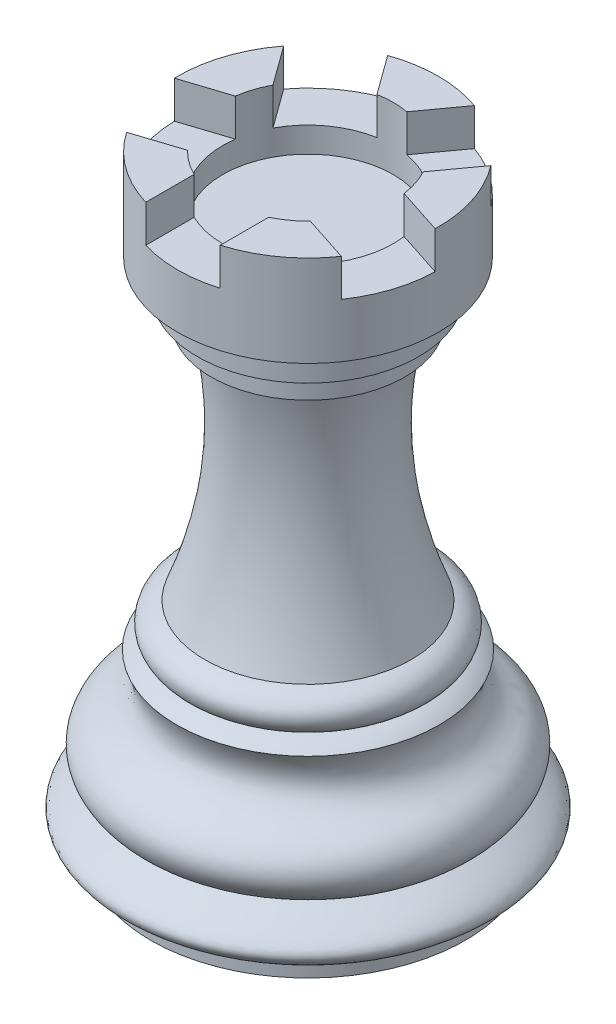
ISO-10303-21;
HEADER;
FILE_DESCRIPTION(('STEP AP214'),'2;1');
FILE_NAME('part.step','',(''),(''),'','','');
FILE_SCHEMA(('AUTOMOTIVE_DESIGN { 1 0 10303 214 1 1 1 1 }'));
ENDSEC;
DATA;
#1=APPLICATION_CONTEXT('core data for automotive mechanical design processes');
#2=APPLICATION_PROTOCOL_DEFINITION('international standard','automotive_design',2000,#1);
#3=PRODUCT_CONTEXT('',#1,'mechanical');
#4=PRODUCT('Part','Part','',(#3));
#5=PRODUCT_RELATED_PRODUCT_CATEGORY('part','',(#4));
#6=PRODUCT_DEFINITION_FORMATION('','',#4);
#7=PRODUCT_DEFINITION_CONTEXT('part definition',#1,'design');
#8=PRODUCT_DEFINITION('design','',#6,#7);
#9=PRODUCT_DEFINITION_SHAPE('','',#8);
#10=(LENGTH_UNIT() NAMED_UNIT(*) SI_UNIT(.MILLI.,.METRE.));
#11=(NAMED_UNIT(*) PLANE_ANGLE_UNIT() SI_UNIT($,.RADIAN.));
#12=(NAMED_UNIT(*) SI_UNIT($,.STERADIAN.) SOLID_ANGLE_UNIT());
#13=UNCERTAINTY_MEASURE_WITH_UNIT(LENGTH_MEASURE(1.E-05),#10,'distance_accuracy_value','');
#14=(GEOMETRIC_REPRESENTATION_CONTEXT(3) GLOBAL_UNCERTAINTY_ASSIGNED_CONTEXT((#13)) GLOBAL_UNIT_ASSIGNED_CONTEXT((#10,
#11,#12)) REPRESENTATION_CONTEXT('',''));
#15=CARTESIAN_POINT('',(0.,0.,0.));
#16=DIRECTION('',(0.,0.,1.));
#17=DIRECTION('',(1.,0.,0.));
#18=AXIS2_PLACEMENT_3D('',#15,#16,#17);
#19=CARTESIAN_POINT('',(0.,0.,0.));
#20=DIRECTION('',(0.,-1.,0.));
#21=DIRECTION('',(0.,0.,-1.));
#22=AXIS2_PLACEMENT_3D('',#19,#20,#21);
#23=CYLINDRICAL_SURFACE('',#22,57.5210916871156);
#24=CARTESIAN_POINT('',(0.,226.302750581283,0.));
#25=DIRECTION('',(0.,-1.,0.));
#26=DIRECTION('',(0.,0.,-1.));
#27=AXIS2_PLACEMENT_3D('',#24,#25,#26);
#28=CIRCLE('',#27,57.5210916871156);
#29=CARTESIAN_POINT('',(0.,226.302750581283,-57.5210916871156));
#30=VERTEX_POINT('',#29);
#31=EDGE_CURVE('E210',#30,#30,#28,.T.);
#32=ORIENTED_EDGE('',*,*,#31,.F.);
#33=EDGE_LOOP('',(#32));
#34=FACE_BOUND('',#33,.T.);
#35=DIRECTION('',(0.,-1.,0.));
#36=VECTOR('',#35,1.);
#37=CARTESIAN_POINT('',(57.5034863087967,0.,1.42304294088054));
#38=LINE('',#37,#36);
#39=CARTESIAN_POINT('',(57.5034863087967,266.575064592113,1.42304294088055));
#40=VERTEX_POINT('',#39);
#41=CARTESIAN_POINT('',(57.5034863087967,250.141255563931,1.42304294088055));
#42=VERTEX_POINT('',#41);
#43=EDGE_CURVE('E175',#40,#42,#38,.T.);
#44=ORIENTED_EDGE('',*,*,#43,.T.);
#45=CARTESIAN_POINT('',(0.,250.141255563931,0.));
#46=DIRECTION('',(0.,1.,0.));
#47=DIRECTION('',(0.,0.,1.));
#48=AXIS2_PLACEMENT_3D('',#45,#46,#47);
#49=CIRCLE('',#48,57.5210916871156);
#50=CARTESIAN_POINT('',(47.3577413136514,250.141255563931,32.6484352848163));
#51=VERTEX_POINT('',#50);
#52=EDGE_CURVE('E239',#42,#51,#49,.F.);
#53=ORIENTED_EDGE('',*,*,#52,.T.);
#54=DIRECTION('',(0.,-1.,0.));
#55=VECTOR('',#54,1.);
#56=CARTESIAN_POINT('',(47.3577413136514,0.,32.6484352848163));
#57=LINE('',#56,#55);
#58=CARTESIAN_POINT('',(47.3577413136514,266.575064592113,32.6484352848163));
#59=VERTEX_POINT('',#58);
#60=EDGE_CURVE('E189',#51,#59,#57,.F.);
#61=ORIENTED_EDGE('',*,*,#60,.T.);
#62=CARTESIAN_POINT('',(0.,266.575064592113,0.));
#63=DIRECTION('',(0.,-1.,0.));
#64=DIRECTION('',(0.,0.,-1.));
#65=AXIS2_PLACEMENT_3D('',#62,#63,#64);
#66=CIRCLE('',#65,57.5210916871156);
#67=CARTESIAN_POINT('',(16.4161602433337,266.575064592113,55.1288098161275));
#68=VERTEX_POINT('',#67);
#69=EDGE_CURVE('E205',#59,#68,#66,.T.);
#70=ORIENTED_EDGE('',*,*,#69,.T.);
#71=DIRECTION('',(0.,-1.,0.));
#72=VECTOR('',#71,1.);
#73=CARTESIAN_POINT('',(16.4161602433337,0.,55.1288098161275));
#74=LINE('',#73,#72);
#75=CARTESIAN_POINT('',(16.4161602433337,250.141255563931,55.1288098161275));
#76=VERTEX_POINT('',#75);
#77=EDGE_CURVE('E341',#68,#76,#74,.T.);
#78=ORIENTED_EDGE('',*,*,#77,.T.);
#79=CARTESIAN_POINT('',(0.,250.141255563931,0.));
#80=DIRECTION('',(0.,1.,0.));
#81=DIRECTION('',(0.,0.,1.));
#82=AXIS2_PLACEMENT_3D('',#79,#80,#81);
#83=CIRCLE('',#82,57.5210916871156);
#84=CARTESIAN_POINT('',(-16.4161602433337,250.141255563931,55.1288098161275));
#85=VERTEX_POINT('',#84);
#86=EDGE_CURVE('E358',#76,#85,#83,.F.);
#87=ORIENTED_EDGE('',*,*,#86,.T.);
#88=DIRECTION('',(0.,-1.,0.));
#89=VECTOR('',#88,1.);
#90=CARTESIAN_POINT('',(-16.4161602433337,0.,55.1288098161275));
#91=LINE('',#90,#89);
#92=CARTESIAN_POINT('',(-16.4161602433337,266.575064592113,55.1288098161275));
#93=VERTEX_POINT('',#92);
#94=EDGE_CURVE('E338',#85,#93,#91,.F.);
#95=ORIENTED_EDGE('',*,*,#94,.T.);
#96=CARTESIAN_POINT('',(-47.3577413136519,266.575064592113,32.6484352848156));
#97=VERTEX_POINT('',#96);
#98=EDGE_CURVE('E207',#93,#97,#66,.T.);
#99=ORIENTED_EDGE('',*,*,#98,.T.);
#100=DIRECTION('',(0.,-1.,0.));
#101=VECTOR('',#100,1.);
#102=CARTESIAN_POINT('',(-47.3577413136519,0.,32.6484352848156));
#103=LINE('',#102,#101);
#104=CARTESIAN_POINT('',(-47.3577413136519,250.141255563931,32.6484352848156));
#105=VERTEX_POINT('',#104);
#106=EDGE_CURVE('E313',#97,#105,#103,.T.);
#107=ORIENTED_EDGE('',*,*,#106,.T.);
#108=CARTESIAN_POINT('',(0.,250.141255563931,0.));
#109=DIRECTION('',(0.,1.,0.));
#110=DIRECTION('',(0.,0.,1.));
#111=AXIS2_PLACEMENT_3D('',#108,#109,#110);
#112=CIRCLE('',#111,57.5210916871156);
#113=CARTESIAN_POINT('',(-57.5034863087967,250.141255563931,1.42304294087972));
#114=VERTEX_POINT('',#113);
#115=EDGE_CURVE('E329',#105,#114,#112,.F.);
#116=ORIENTED_EDGE('',*,*,#115,.T.);
#117=DIRECTION('',(0.,-1.,0.));
#118=VECTOR('',#117,1.);
#119=CARTESIAN_POINT('',(-57.5034863087967,0.,1.42304294087972));
#120=LINE('',#119,#118);
#121=CARTESIAN_POINT('',(-57.5034863087967,266.575064592113,1.42304294087972));
#122=VERTEX_POINT('',#121);
#123=EDGE_CURVE('E310',#114,#122,#120,.F.);
#124=ORIENTED_EDGE('',*,*,#123,.T.);
#125=CARTESIAN_POINT('',(-45.6848540055954,266.575064592113,-34.9509671306102));
#126=VERTEX_POINT('',#125);
#127=EDGE_CURVE('E211',#122,#126,#66,.T.);
#128=ORIENTED_EDGE('',*,*,#127,.T.);
#129=DIRECTION('',(0.,-1.,0.));
#130=VECTOR('',#129,1.);
#131=CARTESIAN_POINT('',(-45.6848540055954,0.,-34.9509671306103));
#132=LINE('',#131,#130);
#133=CARTESIAN_POINT('',(-45.6848540055954,250.141255563931,-34.9509671306103));
#134=VERTEX_POINT('',#133);
#135=EDGE_CURVE('E285',#126,#134,#132,.T.);
#136=ORIENTED_EDGE('',*,*,#135,.T.);
#137=CARTESIAN_POINT('',(0.,250.141255563931,0.));
#138=DIRECTION('',(0.,1.,0.));
#139=DIRECTION('',(0.,0.,1.));
#140=AXIS2_PLACEMENT_3D('',#137,#138,#139);
#141=CIRCLE('',#140,57.5210916871156);
#142=CARTESIAN_POINT('',(-19.1229487671167,250.141255563931,-54.2493209112132));
#143=VERTEX_POINT('',#142);
#144=EDGE_CURVE('E301',#134,#143,#141,.F.);
#145=ORIENTED_EDGE('',*,*,#144,.T.);
#146=DIRECTION('',(0.,-1.,0.));
#147=VECTOR('',#146,1.);
#148=CARTESIAN_POINT('',(-19.1229487671167,0.,-54.2493209112132));
#149=LINE('',#148,#147);
#150=CARTESIAN_POINT('',(-19.1229487671166,266.575064592113,-54.2493209112132));
#151=VERTEX_POINT('',#150);
#152=EDGE_CURVE('E282',#143,#151,#149,.F.);
#153=ORIENTED_EDGE('',*,*,#152,.T.);
#154=CARTESIAN_POINT('',(19.1229487671174,266.575064592113,-54.2493209112129));
#155=VERTEX_POINT('',#154);
#156=EDGE_CURVE('E813',#151,#155,#66,.T.);
#157=ORIENTED_EDGE('',*,*,#156,.T.);
#158=DIRECTION('',(0.,-1.,0.));
#159=VECTOR('',#158,1.);
#160=CARTESIAN_POINT('',(19.1229487671174,0.,-54.2493209112129));
#161=LINE('',#160,#159);
#162=CARTESIAN_POINT('',(19.1229487671174,250.141255563931,-54.2493209112129));
#163=VERTEX_POINT('',#162);
#164=EDGE_CURVE('E260',#155,#163,#161,.T.);
#165=ORIENTED_EDGE('',*,*,#164,.T.);
#166=CARTESIAN_POINT('',(0.,250.141255563931,0.));
#167=DIRECTION('',(0.,1.,0.));
#168=DIRECTION('',(0.,0.,1.));
#169=AXIS2_PLACEMENT_3D('',#166,#167,#168);
#170=CIRCLE('',#169,57.5210916871156);
#171=CARTESIAN_POINT('',(45.6848540055959,250.141255563931,-34.9509671306096));
#172=VERTEX_POINT('',#171);
#173=EDGE_CURVE('E273',#163,#172,#170,.F.);
#174=ORIENTED_EDGE('',*,*,#173,.T.);
#175=DIRECTION('',(0.,-1.,0.));
#176=VECTOR('',#175,1.);
#177=CARTESIAN_POINT('',(45.6848540055959,0.,-34.9509671306096));
#178=LINE('',#177,#176);
#179=CARTESIAN_POINT('',(45.6848540055959,266.575064592113,-34.9509671306096));
#180=VERTEX_POINT('',#179);
#181=EDGE_CURVE('E258',#172,#180,#178,.F.);
#182=ORIENTED_EDGE('',*,*,#181,.T.);
#183=EDGE_CURVE('E241',#180,#40,#66,.T.);
#184=ORIENTED_EDGE('',*,*,#183,.T.);
#185=EDGE_LOOP('',(#44,#53,#61,#70,#78,#87,#95,#99,#107,#116,#124,#128,#136,#145,#153,#157,#165,
#174,#182,#184));
#186=FACE_BOUND('',#185,.T.);
#187=ADVANCED_FACE('F32',(#34,#186),#23,.T.);
#188=CARTESIAN_POINT('',(-37.5725293623646,266.575064592113,0.));
#189=DIRECTION('',(0.,-1.,0.));
#190=DIRECTION('',(0.,0.,-1.));
#191=AXIS2_PLACEMENT_3D('',#188,#189,#190);
#192=PLANE('',#191);
#193=DIRECTION('',(-0.95105651629515,0.,-0.309016994374958));
#194=VECTOR('',#193,1.);
#195=CARTESIAN_POINT('',(108.802676986613,266.575064592113,18.0911603929113));
#196=LINE('',#195,#194);
#197=CARTESIAN_POINT('',(37.215271403501,266.575064592113,-5.1689976832563));
#198=VERTEX_POINT('',#197);
#199=EDGE_CURVE('E169',#40,#198,#196,.T.);
#200=ORIENTED_EDGE('',*,*,#199,.F.);
#201=ORIENTED_EDGE('',*,*,#183,.F.);
#202=DIRECTION('',(-0.58778525229248,0.,0.809016994374942));
#203=VECTOR('',#202,1.);
#204=CARTESIAN_POINT('',(84.3458219921264,266.575064592113,-88.1632244951841));
#205=LINE('',#204,#203);
#206=CARTESIAN_POINT('',(33.1460476230607,266.575064592113,-17.6927807214));
#207=VERTEX_POINT('',#206);
#208=EDGE_CURVE('E194',#180,#207,#205,.T.);
#209=ORIENTED_EDGE('',*,*,#208,.T.);
#210=CARTESIAN_POINT('',(0.,266.575064592113,0.));
#211=DIRECTION('',(0.,-1.,0.));
#212=DIRECTION('',(0.,0.,-1.));
#213=AXIS2_PLACEMENT_3D('',#210,#211,#212);
#214=CIRCLE('',#213,37.5725293623646);
#215=EDGE_CURVE('E187',#207,#198,#214,.T.);
#216=ORIENTED_EDGE('',*,*,#215,.T.);
#217=EDGE_LOOP('',(#200,#201,#209,#216));
#218=FACE_BOUND('',#217,.T.);
#219=ADVANCED_FACE('F193',(#218),#192,.F.);
#220=DIRECTION('',(-0.95105651629515,0.,-0.309016994374958));
#221=VECTOR('',#220,1.);
#222=CARTESIAN_POINT('',(98.6569319914681,266.575064592113,49.316552736847));
#223=LINE('',#222,#221);
#224=CARTESIAN_POINT('',(27.0695264083557,266.575064592113,26.0563946606794));
#225=VERTEX_POINT('',#224);
#226=EDGE_CURVE('E181',#59,#225,#223,.T.);
#227=ORIENTED_EDGE('',*,*,#226,.T.);
#228=CARTESIAN_POINT('',(16.4161602433337,266.575064592113,33.7965182459812));
#229=VERTEX_POINT('',#228);
#230=EDGE_CURVE('E196',#225,#229,#214,.T.);
#231=ORIENTED_EDGE('',*,*,#230,.T.);
#232=DIRECTION('',(0.,0.,-1.));
#233=VECTOR('',#232,1.);
#234=CARTESIAN_POINT('',(16.4161602433337,266.575064592113,86.5568318231254));
#235=LINE('',#234,#233);
#236=EDGE_CURVE('E352',#68,#229,#235,.T.);
#237=ORIENTED_EDGE('',*,*,#236,.F.);
#238=ORIENTED_EDGE('',*,*,#69,.F.);
#239=EDGE_LOOP('',(#227,#231,#237,#238));
#240=FACE_BOUND('',#239,.T.);
#241=ADVANCED_FACE('F440',(#240),#192,.F.);
#242=CARTESIAN_POINT('',(0.,0.,0.));
#243=DIRECTION('',(0.,-1.,0.));
#244=DIRECTION('',(0.,0.,-1.));
#245=AXIS2_PLACEMENT_3D('',#242,#243,#244);
#246=CYLINDRICAL_SURFACE('',#245,37.5725293623646);
#247=CARTESIAN_POINT('',(0.,239.031603244535,0.));
#248=DIRECTION('',(0.,-1.,0.));
#249=DIRECTION('',(0.,0.,-1.));
#250=AXIS2_PLACEMENT_3D('',#247,#248,#249);
#251=CIRCLE('',#250,37.5725293623646);
#252=CARTESIAN_POINT('',(0.,239.031603244535,-37.5725293623646));
#253=VERTEX_POINT('',#252);
#254=EDGE_CURVE('E200',#253,#253,#251,.T.);
#255=ORIENTED_EDGE('',*,*,#254,.T.);
#256=EDGE_LOOP('',(#255));
#257=FACE_BOUND('',#256,.T.);
#258=DIRECTION('',(0.,-1.,0.));
#259=VECTOR('',#258,1.);
#260=CARTESIAN_POINT('',(37.215271403501,0.,-5.16899768325631));
#261=LINE('',#260,#259);
#262=CARTESIAN_POINT('',(37.215271403501,250.141255563931,-5.1689976832563));
#263=VERTEX_POINT('',#262);
#264=EDGE_CURVE('E172',#263,#198,#261,.F.);
#265=ORIENTED_EDGE('',*,*,#264,.T.);
#266=ORIENTED_EDGE('',*,*,#215,.F.);
#267=DIRECTION('',(0.,-1.,0.));
#268=VECTOR('',#267,1.);
#269=CARTESIAN_POINT('',(33.1460476230607,0.,-17.6927807214));
#270=LINE('',#269,#268);
#271=CARTESIAN_POINT('',(33.1460476230607,250.141255563931,-17.6927807214));
#272=VERTEX_POINT('',#271);
#273=EDGE_CURVE('E253',#207,#272,#270,.T.);
#274=ORIENTED_EDGE('',*,*,#273,.T.);
#275=CARTESIAN_POINT('',(0.,250.141255563931,0.));
#276=DIRECTION('',(0.,1.,0.));
#277=DIRECTION('',(0.,0.,1.));
#278=AXIS2_PLACEMENT_3D('',#275,#276,#277);
#279=CIRCLE('',#278,37.5725293623646);
#280=CARTESIAN_POINT('',(6.58414238458225,250.141255563931,-36.9911345020033));
#281=VERTEX_POINT('',#280);
#282=EDGE_CURVE('E270',#272,#281,#279,.T.);
#283=ORIENTED_EDGE('',*,*,#282,.T.);
#284=DIRECTION('',(0.,-1.,0.));
#285=VECTOR('',#284,1.);
#286=CARTESIAN_POINT('',(6.58414238458225,0.,-36.9911345020033));
#287=LINE('',#286,#285);
#288=CARTESIAN_POINT('',(6.58414238458225,266.575064592113,-36.9911345020033));
#289=VERTEX_POINT('',#288);
#290=EDGE_CURVE('E255',#281,#289,#287,.F.);
#291=ORIENTED_EDGE('',*,*,#290,.T.);
#292=CARTESIAN_POINT('',(-6.58414238458172,266.575064592113,-36.9911345020034));
#293=VERTEX_POINT('',#292);
#294=EDGE_CURVE('E195',#293,#289,#214,.T.);
#295=ORIENTED_EDGE('',*,*,#294,.F.);
#296=DIRECTION('',(0.,-1.,0.));
#297=VECTOR('',#296,1.);
#298=CARTESIAN_POINT('',(-6.58414238458172,0.,-36.9911345020034));
#299=LINE('',#298,#297);
#300=CARTESIAN_POINT('',(-6.58414238458172,250.141255563931,-36.9911345020034));
#301=VERTEX_POINT('',#300);
#302=EDGE_CURVE('E276',#293,#301,#299,.T.);
#303=ORIENTED_EDGE('',*,*,#302,.T.);
#304=CARTESIAN_POINT('',(0.,250.141255563931,0.));
#305=DIRECTION('',(0.,1.,0.));
#306=DIRECTION('',(0.,0.,1.));
#307=AXIS2_PLACEMENT_3D('',#304,#305,#306);
#308=CIRCLE('',#307,37.5725293623646);
#309=CARTESIAN_POINT('',(-33.1460476230605,250.141255563931,-17.6927807214004));
#310=VERTEX_POINT('',#309);
#311=EDGE_CURVE('E298',#301,#310,#308,.T.);
#312=ORIENTED_EDGE('',*,*,#311,.T.);
#313=DIRECTION('',(0.,-1.,0.));
#314=VECTOR('',#313,1.);
#315=CARTESIAN_POINT('',(-33.1460476230605,0.,-17.6927807214004));
#316=LINE('',#315,#314);
#317=CARTESIAN_POINT('',(-33.1460476230605,266.575064592113,-17.6927807214004));
#318=VERTEX_POINT('',#317);
#319=EDGE_CURVE('E279',#310,#318,#316,.F.);
#320=ORIENTED_EDGE('',*,*,#319,.T.);
#321=CARTESIAN_POINT('',(-37.2152714035009,266.575064592113,-5.16899768325685));
#322=VERTEX_POINT('',#321);
#323=EDGE_CURVE('E199',#322,#318,#214,.T.);
#324=ORIENTED_EDGE('',*,*,#323,.F.);
#325=DIRECTION('',(0.,-1.,0.));
#326=VECTOR('',#325,1.);
#327=CARTESIAN_POINT('',(-37.2152714035009,0.,-5.16899768325685));
#328=LINE('',#327,#326);
#329=CARTESIAN_POINT('',(-37.2152714035009,250.141255563931,-5.16899768325685));
#330=VERTEX_POINT('',#329);
#331=EDGE_CURVE('E304',#322,#330,#328,.T.);
#332=ORIENTED_EDGE('',*,*,#331,.T.);
#333=CARTESIAN_POINT('',(0.,250.141255563931,0.));
#334=DIRECTION('',(0.,1.,0.));
#335=DIRECTION('',(0.,0.,1.));
#336=AXIS2_PLACEMENT_3D('',#333,#334,#335);
#337=CIRCLE('',#336,37.5725293623646);
#338=CARTESIAN_POINT('',(-27.0695264083561,250.141255563931,26.056394660679));
#339=VERTEX_POINT('',#338);
#340=EDGE_CURVE('E326',#330,#339,#337,.T.);
#341=ORIENTED_EDGE('',*,*,#340,.T.);
#342=DIRECTION('',(0.,-1.,0.));
#343=VECTOR('',#342,1.);
#344=CARTESIAN_POINT('',(-27.0695264083561,0.,26.056394660679));
#345=LINE('',#344,#343);
#346=CARTESIAN_POINT('',(-27.0695264083561,266.575064592113,26.056394660679));
#347=VERTEX_POINT('',#346);
#348=EDGE_CURVE('E307',#339,#347,#345,.F.);
#349=ORIENTED_EDGE('',*,*,#348,.T.);
#350=CARTESIAN_POINT('',(-16.4161602433337,266.575064592113,33.7965182459812));
#351=VERTEX_POINT('',#350);
#352=EDGE_CURVE('E201',#351,#347,#214,.T.);
#353=ORIENTED_EDGE('',*,*,#352,.F.);
#354=DIRECTION('',(0.,-1.,0.));
#355=VECTOR('',#354,1.);
#356=CARTESIAN_POINT('',(-16.4161602433337,0.,33.7965182459812));
#357=LINE('',#356,#355);
#358=CARTESIAN_POINT('',(-16.4161602433337,250.141255563931,33.7965182459812));
#359=VERTEX_POINT('',#358);
#360=EDGE_CURVE('E332',#351,#359,#357,.T.);
#361=ORIENTED_EDGE('',*,*,#360,.T.);
#362=CARTESIAN_POINT('',(0.,250.141255563931,0.));
#363=DIRECTION('',(0.,1.,0.));
#364=DIRECTION('',(0.,0.,1.));
#365=AXIS2_PLACEMENT_3D('',#362,#363,#364);
#366=CIRCLE('',#365,37.5725293623646);
#367=CARTESIAN_POINT('',(16.4161602433337,250.141255563931,33.7965182459812));
#368=VERTEX_POINT('',#367);
#369=EDGE_CURVE('E355',#359,#368,#366,.T.);
#370=ORIENTED_EDGE('',*,*,#369,.T.);
#371=DIRECTION('',(0.,-1.,0.));
#372=VECTOR('',#371,1.);
#373=CARTESIAN_POINT('',(16.4161602433337,0.,33.7965182459812));
#374=LINE('',#373,#372);
#375=EDGE_CURVE('E335',#368,#229,#374,.F.);
#376=ORIENTED_EDGE('',*,*,#375,.T.);
#377=ORIENTED_EDGE('',*,*,#230,.F.);
#378=DIRECTION('',(0.,-1.,0.));
#379=VECTOR('',#378,1.);
#380=CARTESIAN_POINT('',(27.0695264083557,0.,26.0563946606794));
#381=LINE('',#380,#379);
#382=CARTESIAN_POINT('',(27.0695264083557,250.141255563931,26.0563946606794));
#383=VERTEX_POINT('',#382);
#384=EDGE_CURVE('E190',#225,#383,#381,.T.);
#385=ORIENTED_EDGE('',*,*,#384,.T.);
#386=CARTESIAN_POINT('',(0.,250.141255563931,0.));
#387=DIRECTION('',(0.,1.,0.));
#388=DIRECTION('',(0.,0.,1.));
#389=AXIS2_PLACEMENT_3D('',#386,#387,#388);
#390=CIRCLE('',#389,37.5725293623646);
#391=EDGE_CURVE('E180',#383,#263,#390,.T.);
#392=ORIENTED_EDGE('',*,*,#391,.T.);
#393=EDGE_LOOP('',(#265,#266,#274,#283,#291,#295,#303,#312,#320,#324,#332,#341,#349,#353,#361,
#370,#376,#377,#385,#392));
#394=FACE_BOUND('',#393,.T.);
#395=ADVANCED_FACE('F185',(#257,#394),#246,.F.);
#396=DIRECTION('',(-0.58778525229248,0.,0.809016994374942));
#397=VECTOR('',#396,1.);
#398=CARTESIAN_POINT('',(57.783916753648,266.575064592113,-107.461578275787));
#399=LINE('',#398,#397);
#400=EDGE_CURVE('E268',#155,#289,#399,.T.);
#401=ORIENTED_EDGE('',*,*,#400,.F.);
#402=ORIENTED_EDGE('',*,*,#156,.F.);
#403=DIRECTION('',(0.587785252292469,0.,0.809016994374951));
#404=VECTOR('',#403,1.);
#405=CARTESIAN_POINT('',(-57.7839167536463,266.575064592113,-107.461578275788));
#406=LINE('',#405,#404);
#407=EDGE_CURVE('E293',#151,#293,#406,.T.);
#408=ORIENTED_EDGE('',*,*,#407,.T.);
#409=ORIENTED_EDGE('',*,*,#294,.T.);
#410=EDGE_LOOP('',(#401,#402,#408,#409));
#411=FACE_BOUND('',#410,.T.);
#412=ADVANCED_FACE('F439',(#411),#192,.F.);
#413=DIRECTION('',(0.587785252292469,0.,0.809016994374951));
#414=VECTOR('',#413,1.);
#415=CARTESIAN_POINT('',(-84.345821992125,266.575064592113,-88.1632244951851));
#416=LINE('',#415,#414);
#417=EDGE_CURVE('E296',#126,#318,#416,.T.);
#418=ORIENTED_EDGE('',*,*,#417,.F.);
#419=ORIENTED_EDGE('',*,*,#127,.F.);
#420=DIRECTION('',(0.951056516295154,0.,-0.309016994374945));
#421=VECTOR('',#420,1.);
#422=CARTESIAN_POINT('',(-108.802676986613,266.575064592113,18.0911603929095));
#423=LINE('',#422,#421);
#424=EDGE_CURVE('E321',#122,#322,#423,.T.);
#425=ORIENTED_EDGE('',*,*,#424,.T.);
#426=ORIENTED_EDGE('',*,*,#323,.T.);
#427=EDGE_LOOP('',(#418,#419,#425,#426));
#428=FACE_BOUND('',#427,.T.);
#429=ADVANCED_FACE('F444',(#428),#192,.F.);
#430=DIRECTION('',(0.951056516295154,0.,-0.309016994374945));
#431=VECTOR('',#430,1.);
#432=CARTESIAN_POINT('',(-98.656931991468,266.575064592113,49.3165527368454));
#433=LINE('',#432,#431);
#434=EDGE_CURVE('E324',#97,#347,#433,.T.);
#435=ORIENTED_EDGE('',*,*,#434,.F.);
#436=ORIENTED_EDGE('',*,*,#98,.F.);
#437=DIRECTION('',(0.,0.,-1.));
#438=VECTOR('',#437,1.);
#439=CARTESIAN_POINT('',(-16.4161602433337,266.575064592113,86.5568318231254));
#440=LINE('',#439,#438);
#441=EDGE_CURVE('E349',#93,#351,#440,.T.);
#442=ORIENTED_EDGE('',*,*,#441,.T.);
#443=ORIENTED_EDGE('',*,*,#352,.T.);
#444=EDGE_LOOP('',(#435,#436,#442,#443));
#445=FACE_BOUND('',#444,.T.);
#446=ADVANCED_FACE('F442',(#445),#192,.F.);
#447=CARTESIAN_POINT('',(-48.7584516199391,212.596057110734,0.));
#448=CARTESIAN_POINT('',(-42.4683762330746,211.963877378023,0.));
#449=CARTESIAN_POINT('',(-42.6140717883137,208.184707488028,0.));
#450=B_SPLINE_CURVE_WITH_KNOTS('',2,(#447,#448,#449),.UNSPECIFIED.,.F.,.F.,(3,3),(0.,1.),.UNSPECIFIED.);
#451=CARTESIAN_POINT('',(0.,0.,0.));
#452=DIRECTION('',(0.,-1.,0.));
#453=AXIS1_PLACEMENT('',#451,#452);
#454=SURFACE_OF_REVOLUTION('',#450,#453);
#455=CARTESIAN_POINT('',(0.,208.184707488028,0.));
#456=DIRECTION('',(0.,-1.,0.));
#457=DIRECTION('',(0.,0.,-1.));
#458=AXIS2_PLACEMENT_3D('',#455,#456,#457);
#459=CIRCLE('',#458,42.6140717883137);
#460=CARTESIAN_POINT('',(0.,208.184707488028,-42.6140717883137));
#461=VERTEX_POINT('',#460);
#462=EDGE_CURVE('E360',#461,#461,#459,.T.);
#463=ORIENTED_EDGE('',*,*,#462,.F.);
#464=EDGE_LOOP('',(#463));
#465=FACE_BOUND('',#464,.T.);
#466=CARTESIAN_POINT('',(0.,212.596057110734,0.));
#467=DIRECTION('',(0.,-1.,0.));
#468=DIRECTION('',(0.,0.,-1.));
#469=AXIS2_PLACEMENT_3D('',#466,#467,#468);
#470=CIRCLE('',#469,48.7584516199391);
#471=CARTESIAN_POINT('',(0.,212.596057110734,-48.7584516199391));
#472=VERTEX_POINT('',#471);
#473=EDGE_CURVE('E11',#472,#472,#470,.T.);
#474=ORIENTED_EDGE('',*,*,#473,.T.);
#475=EDGE_LOOP('',(#474));
#476=FACE_BOUND('',#475,.T.);
#477=ADVANCED_FACE('F34',(#465,#476),#454,.T.);
#478=CARTESIAN_POINT('',(0.,0.,0.));
#479=DIRECTION('',(0.,-1.,0.));
#480=DIRECTION('',(0.,0.,-1.));
#481=AXIS2_PLACEMENT_3D('',#478,#479,#480);
#482=CYLINDRICAL_SURFACE('',#481,48.7584516199391);
#483=ORIENTED_EDGE('',*,*,#473,.F.);
#484=EDGE_LOOP('',(#483));
#485=FACE_BOUND('',#484,.T.);
#486=CARTESIAN_POINT('',(0.,220.315918950468,0.));
#487=DIRECTION('',(0.,-1.,0.));
#488=DIRECTION('',(0.,0.,-1.));
#489=AXIS2_PLACEMENT_3D('',#486,#487,#488);
#490=CIRCLE('',#489,48.7584516199391);
#491=CARTESIAN_POINT('',(0.,220.315918950468,-48.7584516199391));
#492=VERTEX_POINT('',#491);
#493=EDGE_CURVE('E41',#492,#492,#490,.T.);
#494=ORIENTED_EDGE('',*,*,#493,.T.);
#495=EDGE_LOOP('',(#494));
#496=FACE_BOUND('',#495,.T.);
#497=ADVANCED_FACE('F219',(#485,#496),#482,.T.);
#498=CARTESIAN_POINT('',(-52.38206023859,226.302750581283,0.));
#499=CARTESIAN_POINT('',(-50.8426230589593,226.040332782466,0.));
#500=CARTESIAN_POINT('',(-49.0644437378156,225.689385990495,0.));
#501=CARTESIAN_POINT('',(-48.7584516199391,220.315918950468,0.));
#502=B_SPLINE_CURVE_WITH_KNOTS('',3,(#498,#499,#500,#501),.UNSPECIFIED.,.F.,.F.,(4,4),(0.,1.),.UNSPECIFIED.);
#503=CARTESIAN_POINT('',(0.,0.,0.));
#504=DIRECTION('',(0.,-1.,0.));
#505=AXIS1_PLACEMENT('',#503,#504);
#506=SURFACE_OF_REVOLUTION('',#502,#505);
#507=ORIENTED_EDGE('',*,*,#493,.F.);
#508=EDGE_LOOP('',(#507));
#509=FACE_BOUND('',#508,.T.);
#510=CARTESIAN_POINT('',(0.,226.302750581283,0.));
#511=DIRECTION('',(0.,-1.,0.));
#512=DIRECTION('',(0.,0.,-1.));
#513=AXIS2_PLACEMENT_3D('',#510,#511,#512);
#514=CIRCLE('',#513,52.38206023859);
#515=CARTESIAN_POINT('',(0.,226.302750581283,-52.38206023859));
#516=VERTEX_POINT('',#515);
#517=EDGE_CURVE('E214',#516,#516,#514,.T.);
#518=ORIENTED_EDGE('',*,*,#517,.T.);
#519=EDGE_LOOP('',(#518));
#520=FACE_BOUND('',#519,.T.);
#521=ADVANCED_FACE('F221',(#509,#520),#506,.T.);
#522=CARTESIAN_POINT('',(-57.5210916871156,226.302750581283,0.));
#523=DIRECTION('',(0.,1.,0.));
#524=DIRECTION('',(0.,0.,1.));
#525=AXIS2_PLACEMENT_3D('',#522,#523,#524);
#526=PLANE('',#525);
#527=ORIENTED_EDGE('',*,*,#517,.F.);
#528=EDGE_LOOP('',(#527));
#529=FACE_BOUND('',#528,.T.);
#530=ORIENTED_EDGE('',*,*,#31,.T.);
#531=EDGE_LOOP('',(#530));
#532=FACE_BOUND('',#531,.T.);
#533=ADVANCED_FACE('F224',(#529,#532),#526,.F.);
#534=CARTESIAN_POINT('',(-37.5725293623646,239.031603244535,0.));
#535=DIRECTION('',(0.,-1.,0.));
#536=DIRECTION('',(0.,0.,-1.));
#537=AXIS2_PLACEMENT_3D('',#534,#535,#536);
#538=PLANE('',#537);
#539=ORIENTED_EDGE('',*,*,#254,.F.);
#540=EDGE_LOOP('',(#539));
#541=FACE_BOUND('',#540,.T.);
#542=ADVANCED_FACE('F230',(#541),#538,.F.);
#543=CARTESIAN_POINT('',(0.,0.,0.));
#544=DIRECTION('',(0.,1.,0.));
#545=DIRECTION('',(0.,0.,1.));
#546=AXIS2_PLACEMENT_3D('',#543,#544,#545);
#547=PLANE('',#546);
#548=CARTESIAN_POINT('',(0.,0.,0.));
#549=DIRECTION('',(0.,-1.,0.));
#550=DIRECTION('',(0.,0.,-1.));
#551=AXIS2_PLACEMENT_3D('',#548,#549,#550);
#552=CIRCLE('',#551,69.3752884506841);
#553=CARTESIAN_POINT('',(0.,0.,-69.3752884506841));
#554=VERTEX_POINT('',#553);
#555=EDGE_CURVE('E486',#554,#554,#552,.T.);
#556=ORIENTED_EDGE('',*,*,#555,.T.);
#557=EDGE_LOOP('',(#556));
#558=FACE_BOUND('',#557,.T.);
#559=ADVANCED_FACE('F429',(#558),#547,.F.);
#560=CARTESIAN_POINT('',(0.,0.,0.));
#561=DIRECTION('',(0.,-1.,0.));
#562=DIRECTION('',(0.,0.,-1.));
#563=AXIS2_PLACEMENT_3D('',#560,#561,#562);
#564=CYLINDRICAL_SURFACE('',#563,69.3752884506841);
#565=ORIENTED_EDGE('',*,*,#555,.F.);
#566=EDGE_LOOP('',(#565));
#567=FACE_BOUND('',#566,.T.);
#568=CARTESIAN_POINT('',(0.,5.39170655839967,0.));
#569=DIRECTION('',(0.,-1.,0.));
#570=DIRECTION('',(0.,0.,-1.));
#571=AXIS2_PLACEMENT_3D('',#568,#569,#570);
#572=CIRCLE('',#571,69.3752884506841);
#573=CARTESIAN_POINT('',(0.,5.39170655839967,-69.3752884506841));
#574=VERTEX_POINT('',#573);
#575=EDGE_CURVE('E484',#574,#574,#572,.T.);
#576=ORIENTED_EDGE('',*,*,#575,.T.);
#577=EDGE_LOOP('',(#576));
#578=FACE_BOUND('',#577,.T.);
#579=ADVANCED_FACE('F425',(#567,#578),#564,.T.);
#580=CARTESIAN_POINT('',(-65.444879120116,27.8902875785498,0.));
#581=CARTESIAN_POINT('',(-88.6409738782525,17.1893641912147,0.));
#582=CARTESIAN_POINT('',(-84.4716897679982,14.7400823049093,0.));
#583=CARTESIAN_POINT('',(-69.375288450684,5.39170655839966,0.));
#584=B_SPLINE_CURVE_WITH_KNOTS('',3,(#580,#581,#582,#583),.UNSPECIFIED.,.F.,.F.,(4,4),(0.,1.),.UNSPECIFIED.);
#585=CARTESIAN_POINT('',(0.,0.,0.));
#586=DIRECTION('',(0.,-1.,0.));
#587=AXIS1_PLACEMENT('',#585,#586);
#588=SURFACE_OF_REVOLUTION('',#584,#587);
#589=ORIENTED_EDGE('',*,*,#575,.F.);
#590=EDGE_LOOP('',(#589));
#591=FACE_BOUND('',#590,.T.);
#592=CARTESIAN_POINT('',(0.,27.8902875785498,0.));
#593=DIRECTION('',(0.,-1.,0.));
#594=DIRECTION('',(0.,0.,-1.));
#595=AXIS2_PLACEMENT_3D('',#592,#593,#594);
#596=CIRCLE('',#595,65.444879120116);
#597=CARTESIAN_POINT('',(0.,27.8902875785498,-65.444879120116));
#598=VERTEX_POINT('',#597);
#599=EDGE_CURVE('E481',#598,#598,#596,.T.);
#600=ORIENTED_EDGE('',*,*,#599,.T.);
#601=EDGE_LOOP('',(#600));
#602=FACE_BOUND('',#601,.T.);
#603=ADVANCED_FACE('F422',(#591,#602),#588,.T.);
#604=CARTESIAN_POINT('',(-57.8992673098276,76.5422715045134,0.));
#605=CARTESIAN_POINT('',(-53.8611399801696,68.793250239356,0.));
#606=CARTESIAN_POINT('',(-52.3230202538275,59.4210076909661,0.));
#607=CARTESIAN_POINT('',(-72.6522646989101,50.0113888138938,0.));
#608=CARTESIAN_POINT('',(-78.9772436985183,38.4894045494582,0.));
#609=CARTESIAN_POINT('',(-69.3480096732948,28.8875773544093,0.));
#610=CARTESIAN_POINT('',(-65.444879120116,27.8902875785498,0.));
#611=B_SPLINE_CURVE_WITH_KNOTS('',3,(#604,#605,#606,#607,#608,#609,#610),.UNSPECIFIED.,.F.,.F.,
(4,1,1,1,4),(0.,0.533072534992515,0.606266249522038,0.825963286421147,1.),.UNSPECIFIED.);
#612=CARTESIAN_POINT('',(0.,0.,0.));
#613=DIRECTION('',(0.,-1.,0.));
#614=AXIS1_PLACEMENT('',#612,#613);
#615=SURFACE_OF_REVOLUTION('',#611,#614);
#616=ORIENTED_EDGE('',*,*,#599,.F.);
#617=EDGE_LOOP('',(#616));
#618=FACE_BOUND('',#617,.T.);
#619=CARTESIAN_POINT('',(0.,76.5422715045134,0.));
#620=DIRECTION('',(0.,-1.,0.));
#621=DIRECTION('',(0.,0.,-1.));
#622=AXIS2_PLACEMENT_3D('',#619,#620,#621);
#623=CIRCLE('',#622,57.8992673098276);
#624=CARTESIAN_POINT('',(0.,76.5422715045134,-57.8992673098276));
#625=VERTEX_POINT('',#624);
#626=EDGE_CURVE('E478',#625,#625,#623,.T.);
#627=ORIENTED_EDGE('',*,*,#626,.T.);
#628=EDGE_LOOP('',(#627));
#629=FACE_BOUND('',#628,.T.);
#630=ADVANCED_FACE('F394',(#618,#629),#615,.T.);
#631=CARTESIAN_POINT('',(-50.344750632212,80.3842617299665,0.));
#632=CARTESIAN_POINT('',(-54.4121160866412,79.1949589756904,0.));
#633=CARTESIAN_POINT('',(-57.8992673098276,76.5422715045134,0.));
#634=B_SPLINE_CURVE_WITH_KNOTS('',2,(#631,#632,#633),.UNSPECIFIED.,.F.,.F.,(3,3),(0.,1.),.UNSPECIFIED.);
#635=CARTESIAN_POINT('',(0.,0.,0.));
#636=DIRECTION('',(0.,-1.,0.));
#637=AXIS1_PLACEMENT('',#635,#636);
#638=SURFACE_OF_REVOLUTION('',#634,#637);
#639=ORIENTED_EDGE('',*,*,#626,.F.);
#640=EDGE_LOOP('',(#639));
#641=FACE_BOUND('',#640,.T.);
#642=CARTESIAN_POINT('',(0.,80.3842617299665,0.));
#643=DIRECTION('',(0.,-1.,0.));
#644=DIRECTION('',(0.,0.,-1.));
#645=AXIS2_PLACEMENT_3D('',#642,#643,#644);
#646=CIRCLE('',#645,50.344750632212);
#647=CARTESIAN_POINT('',(0.,80.3842617299665,-50.344750632212));
#648=VERTEX_POINT('',#647);
#649=EDGE_CURVE('E475',#648,#648,#646,.T.);
#650=ORIENTED_EDGE('',*,*,#649,.T.);
#651=EDGE_LOOP('',(#650));
#652=FACE_BOUND('',#651,.T.);
#653=ADVANCED_FACE('F390',(#641,#652),#638,.T.);
#654=CARTESIAN_POINT('',(-45.5412069517653,95.2929136299957,0.));
#655=CARTESIAN_POINT('',(-56.3302759510156,92.2682509235754,0.));
#656=CARTESIAN_POINT('',(-55.7015071052406,83.8254746828488,0.));
#657=CARTESIAN_POINT('',(-50.344750632212,80.3842617299665,0.));
#658=B_SPLINE_CURVE_WITH_KNOTS('',3,(#654,#655,#656,#657),.UNSPECIFIED.,.F.,.F.,(4,4),(0.,1.),.UNSPECIFIED.);
#659=CARTESIAN_POINT('',(0.,0.,0.));
#660=DIRECTION('',(0.,-1.,0.));
#661=AXIS1_PLACEMENT('',#659,#660);
#662=SURFACE_OF_REVOLUTION('',#658,#661);
#663=ORIENTED_EDGE('',*,*,#649,.F.);
#664=EDGE_LOOP('',(#663));
#665=FACE_BOUND('',#664,.T.);
#666=CARTESIAN_POINT('',(0.,95.2929136299957,0.));
#667=DIRECTION('',(0.,-1.,0.));
#668=DIRECTION('',(0.,0.,-1.));
#669=AXIS2_PLACEMENT_3D('',#666,#667,#668);
#670=CIRCLE('',#669,45.5412069517653);
#671=CARTESIAN_POINT('',(0.,95.2929136299957,-45.5412069517653));
#672=VERTEX_POINT('',#671);
#673=EDGE_CURVE('E472',#672,#672,#670,.T.);
#674=ORIENTED_EDGE('',*,*,#673,.T.);
#675=EDGE_LOOP('',(#674));
#676=FACE_BOUND('',#675,.T.);
#677=ADVANCED_FACE('F385',(#665,#676),#662,.T.);
#678=CARTESIAN_POINT('',(-35.9752495907701,198.889363640185,0.));
#679=CARTESIAN_POINT('',(-25.1751407995587,148.004290693057,0.));
#680=CARTESIAN_POINT('',(-45.5412069517653,95.2929136299957,0.));
#681=B_SPLINE_CURVE_WITH_KNOTS('',2,(#678,#679,#680),.UNSPECIFIED.,.F.,.F.,(3,3),(0.,1.),.UNSPECIFIED.);
#682=CARTESIAN_POINT('',(0.,0.,0.));
#683=DIRECTION('',(0.,-1.,0.));
#684=AXIS1_PLACEMENT('',#682,#683);
#685=SURFACE_OF_REVOLUTION('',#681,#684);
#686=ORIENTED_EDGE('',*,*,#673,.F.);
#687=EDGE_LOOP('',(#686));
#688=FACE_BOUND('',#687,.T.);
#689=CARTESIAN_POINT('',(0.,198.889363640185,0.));
#690=DIRECTION('',(0.,-1.,0.));
#691=DIRECTION('',(0.,0.,-1.));
#692=AXIS2_PLACEMENT_3D('',#689,#690,#691);
#693=CIRCLE('',#692,35.9752495907701);
#694=CARTESIAN_POINT('',(0.,198.889363640185,-35.9752495907701));
#695=VERTEX_POINT('',#694);
#696=EDGE_CURVE('E469',#695,#695,#693,.T.);
#697=ORIENTED_EDGE('',*,*,#696,.T.);
#698=EDGE_LOOP('',(#697));
#699=FACE_BOUND('',#698,.T.);
#700=ADVANCED_FACE('F380',(#688,#699),#685,.T.);
#701=CARTESIAN_POINT('',(-37.5725293623646,198.889363640185,0.));
#702=DIRECTION('',(0.,1.,0.));
#703=DIRECTION('',(0.,0.,1.));
#704=AXIS2_PLACEMENT_3D('',#701,#702,#703);
#705=PLANE('',#704);
#706=ORIENTED_EDGE('',*,*,#696,.F.);
#707=EDGE_LOOP('',(#706));
#708=FACE_BOUND('',#707,.T.);
#709=CARTESIAN_POINT('',(0.,198.889363640185,0.));
#710=DIRECTION('',(0.,-1.,0.));
#711=DIRECTION('',(0.,0.,-1.));
#712=AXIS2_PLACEMENT_3D('',#709,#710,#711);
#713=CIRCLE('',#712,37.5725293623646);
#714=CARTESIAN_POINT('',(0.,198.889363640185,-37.5725293623646));
#715=VERTEX_POINT('',#714);
#716=EDGE_CURVE('E466',#715,#715,#713,.T.);
#717=ORIENTED_EDGE('',*,*,#716,.T.);
#718=EDGE_LOOP('',(#717));
#719=FACE_BOUND('',#718,.T.);
#720=ADVANCED_FACE('F384',(#708,#719),#705,.F.);
#721=CARTESIAN_POINT('',(0.,0.,0.));
#722=DIRECTION('',(0.,-1.,0.));
#723=DIRECTION('',(0.,0.,-1.));
#724=AXIS2_PLACEMENT_3D('',#721,#722,#723);
#725=CYLINDRICAL_SURFACE('',#724,37.5725293623646);
#726=ORIENTED_EDGE('',*,*,#716,.F.);
#727=EDGE_LOOP('',(#726));
#728=FACE_BOUND('',#727,.T.);
#729=CARTESIAN_POINT('',(0.,201.725231254781,0.));
#730=DIRECTION('',(0.,-1.,0.));
#731=DIRECTION('',(0.,0.,-1.));
#732=AXIS2_PLACEMENT_3D('',#729,#730,#731);
#733=CIRCLE('',#732,37.5725293623646);
#734=CARTESIAN_POINT('',(0.,201.725231254781,-37.5725293623646));
#735=VERTEX_POINT('',#734);
#736=EDGE_CURVE('E461',#735,#735,#733,.T.);
#737=ORIENTED_EDGE('',*,*,#736,.T.);
#738=EDGE_LOOP('',(#737));
#739=FACE_BOUND('',#738,.T.);
#740=ADVANCED_FACE('F508',(#728,#739),#725,.T.);
#741=CARTESIAN_POINT('',(-37.5725293623646,201.725231254781,0.));
#742=DIRECTION('',(0.,1.,0.));
#743=DIRECTION('',(0.,0.,1.));
#744=AXIS2_PLACEMENT_3D('',#741,#742,#743);
#745=PLANE('',#744);
#746=ORIENTED_EDGE('',*,*,#736,.F.);
#747=EDGE_LOOP('',(#746));
#748=FACE_BOUND('',#747,.T.);
#749=CARTESIAN_POINT('',(0.,201.725231254781,0.));
#750=DIRECTION('',(0.,-1.,0.));
#751=DIRECTION('',(0.,0.,-1.));
#752=AXIS2_PLACEMENT_3D('',#749,#750,#751);
#753=CIRCLE('',#752,42.6140717883137);
#754=CARTESIAN_POINT('',(0.,201.725231254781,-42.6140717883137));
#755=VERTEX_POINT('',#754);
#756=EDGE_CURVE('E459',#755,#755,#753,.T.);
#757=ORIENTED_EDGE('',*,*,#756,.T.);
#758=EDGE_LOOP('',(#757));
#759=FACE_BOUND('',#758,.T.);
#760=ADVANCED_FACE('F513',(#748,#759),#745,.F.);
#761=CARTESIAN_POINT('',(0.,0.,0.));
#762=DIRECTION('',(0.,-1.,0.));
#763=DIRECTION('',(0.,0.,-1.));
#764=AXIS2_PLACEMENT_3D('',#761,#762,#763);
#765=CYLINDRICAL_SURFACE('',#764,42.6140717883137);
#766=ORIENTED_EDGE('',*,*,#756,.F.);
#767=EDGE_LOOP('',(#766));
#768=FACE_BOUND('',#767,.T.);
#769=ORIENTED_EDGE('',*,*,#462,.T.);
#770=EDGE_LOOP('',(#769));
#771=FACE_BOUND('',#770,.T.);
#772=ADVANCED_FACE('F518',(#768,#771),#765,.T.);
#773=CARTESIAN_POINT('',(16.4161602433337,250.141255563931,86.5568318231254));
#774=DIRECTION('',(-1.,0.,0.));
#775=DIRECTION('',(0.,0.,1.));
#776=AXIS2_PLACEMENT_3D('',#773,#774,#775);
#777=PLANE('',#776);
#778=ORIENTED_EDGE('',*,*,#236,.T.);
#779=ORIENTED_EDGE('',*,*,#375,.F.);
#780=DIRECTION('',(0.,0.,-1.));
#781=VECTOR('',#780,1.);
#782=CARTESIAN_POINT('',(16.4161602433337,250.141255563931,86.5568318231254));
#783=LINE('',#782,#781);
#784=EDGE_CURVE('E344',#76,#368,#783,.T.);
#785=ORIENTED_EDGE('',*,*,#784,.F.);
#786=ORIENTED_EDGE('',*,*,#77,.F.);
#787=EDGE_LOOP('',(#778,#779,#785,#786));
#788=FACE_BOUND('',#787,.T.);
#789=ADVANCED_FACE('F523',(#788),#777,.T.);
#790=CARTESIAN_POINT('',(-16.4161602433337,250.141255563931,86.5568318231254));
#791=DIRECTION('',(1.,0.,0.));
#792=DIRECTION('',(0.,0.,-1.));
#793=AXIS2_PLACEMENT_3D('',#790,#791,#792);
#794=PLANE('',#793);
#795=DIRECTION('',(0.,0.,-1.));
#796=VECTOR('',#795,1.);
#797=CARTESIAN_POINT('',(-16.4161602433337,250.141255563931,86.5568318231254));
#798=LINE('',#797,#796);
#799=EDGE_CURVE('E346',#85,#359,#798,.T.);
#800=ORIENTED_EDGE('',*,*,#799,.T.);
#801=ORIENTED_EDGE('',*,*,#360,.F.);
#802=ORIENTED_EDGE('',*,*,#441,.F.);
#803=ORIENTED_EDGE('',*,*,#94,.F.);
#804=EDGE_LOOP('',(#800,#801,#802,#803));
#805=FACE_BOUND('',#804,.T.);
#806=ADVANCED_FACE('F528',(#805),#794,.T.);
#807=CARTESIAN_POINT('',(16.4161602433337,250.141255563931,86.5568318231254));
#808=DIRECTION('',(0.,1.,0.));
#809=DIRECTION('',(0.,0.,1.));
#810=AXIS2_PLACEMENT_3D('',#807,#808,#809);
#811=PLANE('',#810);
#812=ORIENTED_EDGE('',*,*,#784,.T.);
#813=ORIENTED_EDGE('',*,*,#369,.F.);
#814=ORIENTED_EDGE('',*,*,#799,.F.);
#815=ORIENTED_EDGE('',*,*,#86,.F.);
#816=EDGE_LOOP('',(#812,#813,#814,#815));
#817=FACE_BOUND('',#816,.T.);
#818=ADVANCED_FACE('F534',(#817),#811,.T.);
#819=CARTESIAN_POINT('',(-98.656931991468,250.141255563931,49.3165527368454));
#820=DIRECTION('',(-0.309016994374945,0.,-0.951056516295154));
#821=DIRECTION('',(-0.951056516295155,0.,0.309016994374945));
#822=AXIS2_PLACEMENT_3D('',#819,#820,#821);
#823=PLANE('',#822);
#824=ORIENTED_EDGE('',*,*,#434,.T.);
#825=ORIENTED_EDGE('',*,*,#348,.F.);
#826=DIRECTION('',(0.951056516295154,0.,-0.309016994374945));
#827=VECTOR('',#826,1.);
#828=CARTESIAN_POINT('',(-98.656931991468,250.141255563931,49.3165527368454));
#829=LINE('',#828,#827);
#830=EDGE_CURVE('E316',#105,#339,#829,.T.);
#831=ORIENTED_EDGE('',*,*,#830,.F.);
#832=ORIENTED_EDGE('',*,*,#106,.F.);
#833=EDGE_LOOP('',(#824,#825,#831,#832));
#834=FACE_BOUND('',#833,.T.);
#835=ADVANCED_FACE('F538',(#834),#823,.T.);
#836=CARTESIAN_POINT('',(-108.802676986613,250.141255563931,18.0911603929095));
#837=DIRECTION('',(0.309016994374945,0.,0.951056516295154));
#838=DIRECTION('',(0.951056516295155,0.,-0.309016994374945));
#839=AXIS2_PLACEMENT_3D('',#836,#837,#838);
#840=PLANE('',#839);
#841=DIRECTION('',(0.951056516295154,0.,-0.309016994374945));
#842=VECTOR('',#841,1.);
#843=CARTESIAN_POINT('',(-108.802676986613,250.141255563931,18.0911603929095));
#844=LINE('',#843,#842);
#845=EDGE_CURVE('E318',#114,#330,#844,.T.);
#846=ORIENTED_EDGE('',*,*,#845,.T.);
#847=ORIENTED_EDGE('',*,*,#331,.F.);
#848=ORIENTED_EDGE('',*,*,#424,.F.);
#849=ORIENTED_EDGE('',*,*,#123,.F.);
#850=EDGE_LOOP('',(#846,#847,#848,#849));
#851=FACE_BOUND('',#850,.T.);
#852=ADVANCED_FACE('F542',(#851),#840,.T.);
#853=CARTESIAN_POINT('',(-98.656931991468,250.141255563931,49.3165527368454));
#854=DIRECTION('',(0.,1.,0.));
#855=DIRECTION('',(0.,0.,1.));
#856=AXIS2_PLACEMENT_3D('',#853,#854,#855);
#857=PLANE('',#856);
#858=ORIENTED_EDGE('',*,*,#830,.T.);
#859=ORIENTED_EDGE('',*,*,#340,.F.);
#860=ORIENTED_EDGE('',*,*,#845,.F.);
#861=ORIENTED_EDGE('',*,*,#115,.F.);
#862=EDGE_LOOP('',(#858,#859,#860,#861));
#863=FACE_BOUND('',#862,.T.);
#864=ADVANCED_FACE('F546',(#863),#857,.T.);
#865=CARTESIAN_POINT('',(-84.345821992125,250.141255563931,-88.1632244951851));
#866=DIRECTION('',(0.809016994374951,0.,-0.587785252292469));
#867=DIRECTION('',(-0.587785252292469,0.,-0.809016994374951));
#868=AXIS2_PLACEMENT_3D('',#865,#866,#867);
#869=PLANE('',#868);
#870=ORIENTED_EDGE('',*,*,#417,.T.);
#871=ORIENTED_EDGE('',*,*,#319,.F.);
#872=DIRECTION('',(0.587785252292469,0.,0.809016994374951));
#873=VECTOR('',#872,1.);
#874=CARTESIAN_POINT('',(-84.345821992125,250.141255563931,-88.1632244951851));
#875=LINE('',#874,#873);
#876=EDGE_CURVE('E288',#134,#310,#875,.T.);
#877=ORIENTED_EDGE('',*,*,#876,.F.);
#878=ORIENTED_EDGE('',*,*,#135,.F.);
#879=EDGE_LOOP('',(#870,#871,#877,#878));
#880=FACE_BOUND('',#879,.T.);
#881=ADVANCED_FACE('F550',(#880),#869,.T.);
#882=CARTESIAN_POINT('',(-57.7839167536463,250.141255563931,-107.461578275788));
#883=DIRECTION('',(-0.809016994374951,0.,0.587785252292469));
#884=DIRECTION('',(0.587785252292469,0.,0.809016994374951));
#885=AXIS2_PLACEMENT_3D('',#882,#883,#884);
#886=PLANE('',#885);
#887=DIRECTION('',(0.587785252292469,0.,0.809016994374951));
#888=VECTOR('',#887,1.);
#889=CARTESIAN_POINT('',(-57.7839167536463,250.141255563931,-107.461578275788));
#890=LINE('',#889,#888);
#891=EDGE_CURVE('E290',#143,#301,#890,.T.);
#892=ORIENTED_EDGE('',*,*,#891,.T.);
#893=ORIENTED_EDGE('',*,*,#302,.F.);
#894=ORIENTED_EDGE('',*,*,#407,.F.);
#895=ORIENTED_EDGE('',*,*,#152,.F.);
#896=EDGE_LOOP('',(#892,#893,#894,#895));
#897=FACE_BOUND('',#896,.T.);
#898=ADVANCED_FACE('F554',(#897),#886,.T.);
#899=CARTESIAN_POINT('',(-84.345821992125,250.141255563931,-88.1632244951851));
#900=DIRECTION('',(0.,1.,0.));
#901=DIRECTION('',(0.,0.,1.));
#902=AXIS2_PLACEMENT_3D('',#899,#900,#901);
#903=PLANE('',#902);
#904=ORIENTED_EDGE('',*,*,#876,.T.);
#905=ORIENTED_EDGE('',*,*,#311,.F.);
#906=ORIENTED_EDGE('',*,*,#891,.F.);
#907=ORIENTED_EDGE('',*,*,#144,.F.);
#908=EDGE_LOOP('',(#904,#905,#906,#907));
#909=FACE_BOUND('',#908,.T.);
#910=ADVANCED_FACE('F558',(#909),#903,.T.);
#911=CARTESIAN_POINT('',(57.783916753648,250.141255563931,-107.461578275787));
#912=DIRECTION('',(0.809016994374942,0.,0.58778525229248));
#913=DIRECTION('',(0.58778525229248,0.,-0.809016994374942));
#914=AXIS2_PLACEMENT_3D('',#911,#912,#913);
#915=PLANE('',#914);
#916=ORIENTED_EDGE('',*,*,#400,.T.);
#917=ORIENTED_EDGE('',*,*,#290,.F.);
#918=DIRECTION('',(-0.58778525229248,0.,0.809016994374942));
#919=VECTOR('',#918,1.);
#920=CARTESIAN_POINT('',(57.783916753648,250.141255563931,-107.461578275787));
#921=LINE('',#920,#919);
#922=EDGE_CURVE('E56',#163,#281,#921,.T.);
#923=ORIENTED_EDGE('',*,*,#922,.F.);
#924=ORIENTED_EDGE('',*,*,#164,.F.);
#925=EDGE_LOOP('',(#916,#917,#923,#924));
#926=FACE_BOUND('',#925,.T.);
#927=ADVANCED_FACE('F562',(#926),#915,.T.);
#928=CARTESIAN_POINT('',(84.3458219921264,250.141255563931,-88.1632244951841));
#929=DIRECTION('',(-0.809016994374942,0.,-0.58778525229248));
#930=DIRECTION('',(-0.58778525229248,0.,0.809016994374942));
#931=AXIS2_PLACEMENT_3D('',#928,#929,#930);
#932=PLANE('',#931);
#933=DIRECTION('',(-0.58778525229248,0.,0.809016994374942));
#934=VECTOR('',#933,1.);
#935=CARTESIAN_POINT('',(84.3458219921264,250.141255563931,-88.1632244951841));
#936=LINE('',#935,#934);
#937=EDGE_CURVE('E264',#172,#272,#936,.T.);
#938=ORIENTED_EDGE('',*,*,#937,.T.);
#939=ORIENTED_EDGE('',*,*,#273,.F.);
#940=ORIENTED_EDGE('',*,*,#208,.F.);
#941=ORIENTED_EDGE('',*,*,#181,.F.);
#942=EDGE_LOOP('',(#938,#939,#940,#941));
#943=FACE_BOUND('',#942,.T.);
#944=ADVANCED_FACE('F566',(#943),#932,.T.);
#945=CARTESIAN_POINT('',(57.783916753648,250.141255563931,-107.461578275787));
#946=DIRECTION('',(0.,1.,0.));
#947=DIRECTION('',(0.,0.,1.));
#948=AXIS2_PLACEMENT_3D('',#945,#946,#947);
#949=PLANE('',#948);
#950=ORIENTED_EDGE('',*,*,#922,.T.);
#951=ORIENTED_EDGE('',*,*,#282,.F.);
#952=ORIENTED_EDGE('',*,*,#937,.F.);
#953=ORIENTED_EDGE('',*,*,#173,.F.);
#954=EDGE_LOOP('',(#950,#951,#952,#953));
#955=FACE_BOUND('',#954,.T.);
#956=ADVANCED_FACE('F570',(#955),#949,.T.);
#957=CARTESIAN_POINT('',(108.802676986613,250.141255563931,18.0911603929113));
#958=DIRECTION('',(-0.309016994374958,0.,0.95105651629515));
#959=DIRECTION('',(0.95105651629515,0.,0.309016994374958));
#960=AXIS2_PLACEMENT_3D('',#957,#958,#959);
#961=PLANE('',#960);
#962=ORIENTED_EDGE('',*,*,#199,.T.);
#963=ORIENTED_EDGE('',*,*,#264,.F.);
#964=DIRECTION('',(-0.95105651629515,0.,-0.309016994374958));
#965=VECTOR('',#964,1.);
#966=CARTESIAN_POINT('',(108.802676986613,250.141255563931,18.0911603929113));
#967=LINE('',#966,#965);
#968=EDGE_CURVE('E48',#42,#263,#967,.T.);
#969=ORIENTED_EDGE('',*,*,#968,.F.);
#970=ORIENTED_EDGE('',*,*,#43,.F.);
#971=EDGE_LOOP('',(#962,#963,#969,#970));
#972=FACE_BOUND('',#971,.T.);
#973=ADVANCED_FACE('F171',(#972),#961,.T.);
#974=CARTESIAN_POINT('',(98.6569319914681,250.141255563931,49.316552736847));
#975=DIRECTION('',(0.309016994374958,0.,-0.95105651629515));
#976=DIRECTION('',(-0.95105651629515,0.,-0.309016994374958));
#977=AXIS2_PLACEMENT_3D('',#974,#975,#976);
#978=PLANE('',#977);
#979=DIRECTION('',(-0.95105651629515,0.,-0.309016994374958));
#980=VECTOR('',#979,1.);
#981=CARTESIAN_POINT('',(98.6569319914681,250.141255563931,49.316552736847));
#982=LINE('',#981,#980);
#983=EDGE_CURVE('E243',#51,#383,#982,.T.);
#984=ORIENTED_EDGE('',*,*,#983,.T.);
#985=ORIENTED_EDGE('',*,*,#384,.F.);
#986=ORIENTED_EDGE('',*,*,#226,.F.);
#987=ORIENTED_EDGE('',*,*,#60,.F.);
#988=EDGE_LOOP('',(#984,#985,#986,#987));
#989=FACE_BOUND('',#988,.T.);
#990=ADVANCED_FACE('F576',(#989),#978,.T.);
#991=CARTESIAN_POINT('',(108.802676986613,250.141255563931,18.0911603929113));
#992=DIRECTION('',(0.,1.,0.));
#993=DIRECTION('',(0.,0.,1.));
#994=AXIS2_PLACEMENT_3D('',#991,#992,#993);
#995=PLANE('',#994);
#996=ORIENTED_EDGE('',*,*,#968,.T.);
#997=ORIENTED_EDGE('',*,*,#391,.F.);
#998=ORIENTED_EDGE('',*,*,#983,.F.);
#999=ORIENTED_EDGE('',*,*,#52,.F.);
#1000=EDGE_LOOP('',(#996,#997,#998,#999));
#1001=FACE_BOUND('',#1000,.T.);
#1002=ADVANCED_FACE('F579',(#1001),#995,.T.);
#1003=CLOSED_SHELL('',(#187,#219,#241,#395,#412,#429,#446,#477,#497,#521,#533,#542,#559,#579,
#603,#630,#653,#677,#700,#720,#740,#760,#772,#789,#806,#818,#835,#852,#864,#881,#898,#910,#927,
#944,#956,#973,#990,#1002));
#1004=MANIFOLD_SOLID_BREP('B2',#1003);
#1005=ADVANCED_BREP_SHAPE_REPRESENTATION('',(#18,#1004),#14);
#1006=SHAPE_DEFINITION_REPRESENTATION(#9,#1005);
ENDSEC;
END-ISO-10303-21;
